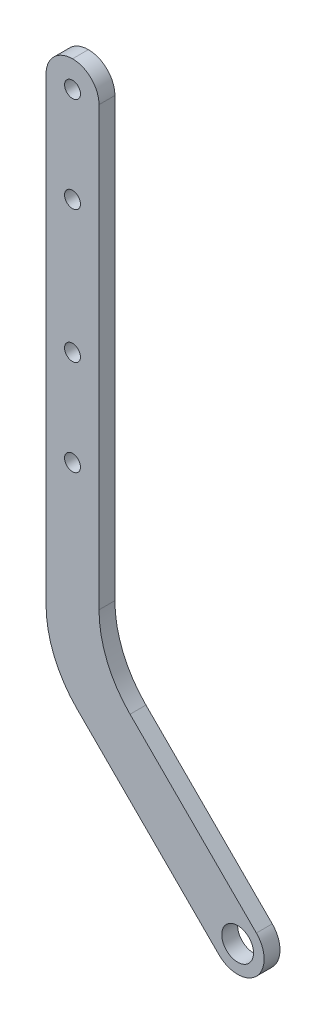
ISO-10303-21;
HEADER;
FILE_DESCRIPTION(('STEP AP214'),'2;1');
FILE_NAME('part.step','',(''),(''),'','','');
FILE_SCHEMA(('AUTOMOTIVE_DESIGN { 1 0 10303 214 1 1 1 1 }'));
ENDSEC;
DATA;
#1=APPLICATION_CONTEXT('core data for automotive mechanical design processes');
#2=APPLICATION_PROTOCOL_DEFINITION('international standard','automotive_design',2000,#1);
#3=PRODUCT_CONTEXT('',#1,'mechanical');
#4=PRODUCT('Part','Part','',(#3));
#5=PRODUCT_RELATED_PRODUCT_CATEGORY('part','',(#4));
#6=PRODUCT_DEFINITION_FORMATION('','',#4);
#7=PRODUCT_DEFINITION_CONTEXT('part definition',#1,'design');
#8=PRODUCT_DEFINITION('design','',#6,#7);
#9=PRODUCT_DEFINITION_SHAPE('','',#8);
#10=(LENGTH_UNIT() NAMED_UNIT(*) SI_UNIT(.MILLI.,.METRE.));
#11=(NAMED_UNIT(*) PLANE_ANGLE_UNIT() SI_UNIT($,.RADIAN.));
#12=(NAMED_UNIT(*) SI_UNIT($,.STERADIAN.) SOLID_ANGLE_UNIT());
#13=UNCERTAINTY_MEASURE_WITH_UNIT(LENGTH_MEASURE(1.E-05),#10,'distance_accuracy_value','');
#14=(GEOMETRIC_REPRESENTATION_CONTEXT(3) GLOBAL_UNCERTAINTY_ASSIGNED_CONTEXT((#13)) GLOBAL_UNIT_ASSIGNED_CONTEXT((#10,
#11,#12)) REPRESENTATION_CONTEXT('',''));
#15=CARTESIAN_POINT('',(0.,0.,0.));
#16=DIRECTION('',(0.,0.,1.));
#17=DIRECTION('',(1.,0.,0.));
#18=AXIS2_PLACEMENT_3D('',#15,#16,#17);
#19=CARTESIAN_POINT('',(0.,0.,3.));
#20=DIRECTION('',(0.,0.,-1.));
#21=DIRECTION('',(-1.,0.,0.));
#22=AXIS2_PLACEMENT_3D('',#19,#20,#21);
#23=PLANE('',#22);
#24=CARTESIAN_POINT('',(5.,95.,3.));
#25=DIRECTION('',(0.,0.,-1.));
#26=DIRECTION('',(-1.,0.,0.));
#27=AXIS2_PLACEMENT_3D('',#24,#25,#26);
#28=CIRCLE('',#27,5.);
#29=CARTESIAN_POINT('',(10.,95.,3.));
#30=VERTEX_POINT('',#29);
#31=CARTESIAN_POINT('',(5.,100.,3.));
#32=VERTEX_POINT('',#31);
#33=EDGE_CURVE('E56',#30,#32,#28,.F.);
#34=ORIENTED_EDGE('',*,*,#33,.T.);
#35=CARTESIAN_POINT('',(5.,95.,3.));
#36=DIRECTION('',(0.,0.,-1.));
#37=DIRECTION('',(-1.,0.,0.));
#38=AXIS2_PLACEMENT_3D('',#35,#36,#37);
#39=CIRCLE('',#38,5.);
#40=CARTESIAN_POINT('',(0.,95.,3.));
#41=VERTEX_POINT('',#40);
#42=EDGE_CURVE('E49',#32,#41,#39,.F.);
#43=ORIENTED_EDGE('',*,*,#42,.T.);
#44=DIRECTION('',(0.,-1.,0.));
#45=VECTOR('',#44,1.);
#46=CARTESIAN_POINT('',(0.,0.,3.));
#47=LINE('',#46,#45);
#48=CARTESIAN_POINT('',(0.,8.28427124746192,3.));
#49=VERTEX_POINT('',#48);
#50=EDGE_CURVE('E141',#41,#49,#47,.T.);
#51=ORIENTED_EDGE('',*,*,#50,.T.);
#52=CARTESIAN_POINT('',(20.,8.28427124746192,3.));
#53=DIRECTION('',(0.,0.,-1.));
#54=DIRECTION('',(-1.,0.,0.));
#55=AXIS2_PLACEMENT_3D('',#52,#53,#54);
#56=CIRCLE('',#55,20.);
#57=CARTESIAN_POINT('',(5.85786437626908,-5.85786437626906,3.));
#58=VERTEX_POINT('',#57);
#59=EDGE_CURVE('E168',#49,#58,#56,.F.);
#60=ORIENTED_EDGE('',*,*,#59,.T.);
#61=DIRECTION('',(0.707106781186549,-0.707106781186546,0.));
#62=VECTOR('',#61,1.);
#63=CARTESIAN_POINT('',(0.,0.,3.));
#64=LINE('',#63,#62);
#65=CARTESIAN_POINT('',(32.6287556748131,-32.628755674813,3.));
#66=VERTEX_POINT('',#65);
#67=EDGE_CURVE('E139',#58,#66,#64,.T.);
#68=ORIENTED_EDGE('',*,*,#67,.T.);
#69=CARTESIAN_POINT('',(36.1642895807458,-29.0932217688802,3.));
#70=DIRECTION('',(0.,0.,-1.));
#71=DIRECTION('',(-1.,0.,0.));
#72=AXIS2_PLACEMENT_3D('',#69,#70,#71);
#73=CIRCLE('',#72,5.);
#74=CARTESIAN_POINT('',(39.6998234866786,-32.628755674813,3.));
#75=VERTEX_POINT('',#74);
#76=EDGE_CURVE('E197',#66,#75,#73,.F.);
#77=ORIENTED_EDGE('',*,*,#76,.T.);
#78=CARTESIAN_POINT('',(36.1642895807458,-29.0932217688802,3.));
#79=DIRECTION('',(0.,0.,-1.));
#80=DIRECTION('',(-1.,0.,0.));
#81=AXIS2_PLACEMENT_3D('',#78,#79,#80);
#82=CIRCLE('',#81,5.);
#83=CARTESIAN_POINT('',(39.6998234866786,-25.5576878629475,3.));
#84=VERTEX_POINT('',#83);
#85=EDGE_CURVE('E194',#75,#84,#82,.F.);
#86=ORIENTED_EDGE('',*,*,#85,.T.);
#87=DIRECTION('',(-0.707106781186549,0.707106781186547,0.));
#88=VECTOR('',#87,1.);
#89=CARTESIAN_POINT('',(10.,4.142135623731,3.));
#90=LINE('',#89,#88);
#91=CARTESIAN_POINT('',(15.8578643762691,-1.71572875253805,3.));
#92=VERTEX_POINT('',#91);
#93=EDGE_CURVE('E274',#84,#92,#90,.T.);
#94=ORIENTED_EDGE('',*,*,#93,.T.);
#95=CARTESIAN_POINT('',(30.,12.4264068711929,3.));
#96=DIRECTION('',(0.,0.,-1.));
#97=DIRECTION('',(-1.,0.,0.));
#98=AXIS2_PLACEMENT_3D('',#95,#96,#97);
#99=CIRCLE('',#98,20.);
#100=CARTESIAN_POINT('',(10.,12.4264068711929,3.));
#101=VERTEX_POINT('',#100);
#102=EDGE_CURVE('E183',#92,#101,#99,.T.);
#103=ORIENTED_EDGE('',*,*,#102,.T.);
#104=DIRECTION('',(0.,1.,0.));
#105=VECTOR('',#104,1.);
#106=CARTESIAN_POINT('',(10.,100.,3.));
#107=LINE('',#106,#105);
#108=EDGE_CURVE('E230',#101,#30,#107,.T.);
#109=ORIENTED_EDGE('',*,*,#108,.T.);
#110=EDGE_LOOP('',(#34,#43,#51,#60,#68,#77,#86,#94,#103,#109));
#111=FACE_BOUND('',#110,.T.);
#112=CARTESIAN_POINT('',(5.,34.,3.));
#113=DIRECTION('',(0.,0.,1.));
#114=DIRECTION('',(1.,0.,0.));
#115=AXIS2_PLACEMENT_3D('',#112,#113,#114);
#116=CIRCLE('',#115,1.5);
#117=CARTESIAN_POINT('',(6.5,34.,3.));
#118=VERTEX_POINT('',#117);
#119=EDGE_CURVE('E149',#118,#118,#116,.T.);
#120=ORIENTED_EDGE('',*,*,#119,.F.);
#121=EDGE_LOOP('',(#120));
#122=FACE_BOUND('',#121,.T.);
#123=CARTESIAN_POINT('',(36.1642895807458,-29.0932217688802,3.));
#124=DIRECTION('',(0.,0.,1.));
#125=DIRECTION('',(1.,0.,0.));
#126=AXIS2_PLACEMENT_3D('',#123,#124,#125);
#127=CIRCLE('',#126,2.99999999999999);
#128=CARTESIAN_POINT('',(39.1642895807458,-29.0932217688802,3.));
#129=VERTEX_POINT('',#128);
#130=EDGE_CURVE('E263',#129,#129,#127,.T.);
#131=ORIENTED_EDGE('',*,*,#130,.F.);
#132=EDGE_LOOP('',(#131));
#133=FACE_BOUND('',#132,.T.);
#134=CARTESIAN_POINT('',(5.00000000000001,52.,3.));
#135=DIRECTION('',(0.,0.,1.));
#136=DIRECTION('',(1.,0.,0.));
#137=AXIS2_PLACEMENT_3D('',#134,#135,#136);
#138=CIRCLE('',#137,1.5);
#139=CARTESIAN_POINT('',(6.50000000000001,52.,3.));
#140=VERTEX_POINT('',#139);
#141=EDGE_CURVE('E255',#140,#140,#138,.T.);
#142=ORIENTED_EDGE('',*,*,#141,.F.);
#143=EDGE_LOOP('',(#142));
#144=FACE_BOUND('',#143,.T.);
#145=CARTESIAN_POINT('',(5.,77.,3.));
#146=DIRECTION('',(0.,0.,1.));
#147=DIRECTION('',(1.,0.,0.));
#148=AXIS2_PLACEMENT_3D('',#145,#146,#147);
#149=CIRCLE('',#148,1.5);
#150=CARTESIAN_POINT('',(6.5,77.,3.));
#151=VERTEX_POINT('',#150);
#152=EDGE_CURVE('E247',#151,#151,#149,.T.);
#153=ORIENTED_EDGE('',*,*,#152,.F.);
#154=EDGE_LOOP('',(#153));
#155=FACE_BOUND('',#154,.T.);
#156=CARTESIAN_POINT('',(5.,95.,3.));
#157=DIRECTION('',(0.,0.,1.));
#158=DIRECTION('',(1.,0.,0.));
#159=AXIS2_PLACEMENT_3D('',#156,#157,#158);
#160=CIRCLE('',#159,1.5);
#161=CARTESIAN_POINT('',(6.5,95.,3.));
#162=VERTEX_POINT('',#161);
#163=EDGE_CURVE('E239',#162,#162,#160,.T.);
#164=ORIENTED_EDGE('',*,*,#163,.F.);
#165=EDGE_LOOP('',(#164));
#166=FACE_BOUND('',#165,.T.);
#167=ADVANCED_FACE('F39',(#111,#122,#133,#144,#155,#166),#23,.F.);
#168=CARTESIAN_POINT('',(0.,0.,0.));
#169=DIRECTION('',(0.,0.,-1.));
#170=DIRECTION('',(-1.,0.,0.));
#171=AXIS2_PLACEMENT_3D('',#168,#169,#170);
#172=PLANE('',#171);
#173=CARTESIAN_POINT('',(5.,77.,0.));
#174=DIRECTION('',(0.,0.,1.));
#175=DIRECTION('',(1.,0.,0.));
#176=AXIS2_PLACEMENT_3D('',#173,#174,#175);
#177=CIRCLE('',#176,1.5);
#178=CARTESIAN_POINT('',(6.5,77.,0.));
#179=VERTEX_POINT('',#178);
#180=EDGE_CURVE('E243',#179,#179,#177,.T.);
#181=ORIENTED_EDGE('',*,*,#180,.T.);
#182=EDGE_LOOP('',(#181));
#183=FACE_BOUND('',#182,.T.);
#184=CARTESIAN_POINT('',(36.1642895807458,-29.0932217688802,0.));
#185=DIRECTION('',(0.,0.,1.));
#186=DIRECTION('',(1.,0.,0.));
#187=AXIS2_PLACEMENT_3D('',#184,#185,#186);
#188=CIRCLE('',#187,2.99999999999999);
#189=CARTESIAN_POINT('',(39.1642895807458,-29.0932217688802,0.));
#190=VERTEX_POINT('',#189);
#191=EDGE_CURVE('E259',#190,#190,#188,.T.);
#192=ORIENTED_EDGE('',*,*,#191,.T.);
#193=EDGE_LOOP('',(#192));
#194=FACE_BOUND('',#193,.T.);
#195=DIRECTION('',(0.,-1.,0.));
#196=VECTOR('',#195,1.);
#197=CARTESIAN_POINT('',(0.,0.,0.));
#198=LINE('',#197,#196);
#199=CARTESIAN_POINT('',(0.,95.,0.));
#200=VERTEX_POINT('',#199);
#201=CARTESIAN_POINT('',(0.,8.28427124746192,0.));
#202=VERTEX_POINT('',#201);
#203=EDGE_CURVE('E163',#200,#202,#198,.T.);
#204=ORIENTED_EDGE('',*,*,#203,.F.);
#205=CARTESIAN_POINT('',(5.,95.,0.));
#206=DIRECTION('',(0.,0.,-1.));
#207=DIRECTION('',(-1.,0.,0.));
#208=AXIS2_PLACEMENT_3D('',#205,#206,#207);
#209=CIRCLE('',#208,5.);
#210=CARTESIAN_POINT('',(5.,100.,0.));
#211=VERTEX_POINT('',#210);
#212=EDGE_CURVE('E215',#200,#211,#209,.T.);
#213=ORIENTED_EDGE('',*,*,#212,.T.);
#214=CARTESIAN_POINT('',(5.,95.,0.));
#215=DIRECTION('',(0.,0.,-1.));
#216=DIRECTION('',(-1.,0.,0.));
#217=AXIS2_PLACEMENT_3D('',#214,#215,#216);
#218=CIRCLE('',#217,5.);
#219=CARTESIAN_POINT('',(10.,95.,0.));
#220=VERTEX_POINT('',#219);
#221=EDGE_CURVE('E212',#211,#220,#218,.T.);
#222=ORIENTED_EDGE('',*,*,#221,.T.);
#223=DIRECTION('',(0.,1.,0.));
#224=VECTOR('',#223,1.);
#225=CARTESIAN_POINT('',(10.,100.,0.));
#226=LINE('',#225,#224);
#227=CARTESIAN_POINT('',(10.,12.4264068711929,0.));
#228=VERTEX_POINT('',#227);
#229=EDGE_CURVE('E153',#228,#220,#226,.T.);
#230=ORIENTED_EDGE('',*,*,#229,.F.);
#231=CARTESIAN_POINT('',(30.,12.4264068711929,0.));
#232=DIRECTION('',(0.,0.,-1.));
#233=DIRECTION('',(-1.,0.,0.));
#234=AXIS2_PLACEMENT_3D('',#231,#232,#233);
#235=CIRCLE('',#234,20.);
#236=CARTESIAN_POINT('',(15.8578643762691,-1.71572875253805,0.));
#237=VERTEX_POINT('',#236);
#238=EDGE_CURVE('E179',#228,#237,#235,.F.);
#239=ORIENTED_EDGE('',*,*,#238,.T.);
#240=DIRECTION('',(-0.707106781186549,0.707106781186547,0.));
#241=VECTOR('',#240,1.);
#242=CARTESIAN_POINT('',(10.,4.142135623731,0.));
#243=LINE('',#242,#241);
#244=CARTESIAN_POINT('',(39.6998234866786,-25.5576878629475,0.));
#245=VERTEX_POINT('',#244);
#246=EDGE_CURVE('E148',#245,#237,#243,.T.);
#247=ORIENTED_EDGE('',*,*,#246,.F.);
#248=CARTESIAN_POINT('',(36.1642895807458,-29.0932217688802,0.));
#249=DIRECTION('',(0.,0.,-1.));
#250=DIRECTION('',(-1.,0.,0.));
#251=AXIS2_PLACEMENT_3D('',#248,#249,#250);
#252=CIRCLE('',#251,5.);
#253=CARTESIAN_POINT('',(39.6998234866786,-32.628755674813,0.));
#254=VERTEX_POINT('',#253);
#255=EDGE_CURVE('E186',#245,#254,#252,.T.);
#256=ORIENTED_EDGE('',*,*,#255,.T.);
#257=CARTESIAN_POINT('',(36.1642895807458,-29.0932217688802,0.));
#258=DIRECTION('',(0.,0.,-1.));
#259=DIRECTION('',(-1.,0.,0.));
#260=AXIS2_PLACEMENT_3D('',#257,#258,#259);
#261=CIRCLE('',#260,5.);
#262=CARTESIAN_POINT('',(32.6287556748131,-32.628755674813,0.));
#263=VERTEX_POINT('',#262);
#264=EDGE_CURVE('E146',#254,#263,#261,.T.);
#265=ORIENTED_EDGE('',*,*,#264,.T.);
#266=DIRECTION('',(0.707106781186549,-0.707106781186546,0.));
#267=VECTOR('',#266,1.);
#268=CARTESIAN_POINT('',(0.,0.,0.));
#269=LINE('',#268,#267);
#270=CARTESIAN_POINT('',(5.85786437626908,-5.85786437626906,0.));
#271=VERTEX_POINT('',#270);
#272=EDGE_CURVE('E136',#271,#263,#269,.T.);
#273=ORIENTED_EDGE('',*,*,#272,.F.);
#274=CARTESIAN_POINT('',(20.,8.28427124746192,0.));
#275=DIRECTION('',(0.,0.,-1.));
#276=DIRECTION('',(-1.,0.,0.));
#277=AXIS2_PLACEMENT_3D('',#274,#275,#276);
#278=CIRCLE('',#277,20.);
#279=EDGE_CURVE('E119',#271,#202,#278,.T.);
#280=ORIENTED_EDGE('',*,*,#279,.T.);
#281=EDGE_LOOP('',(#204,#213,#222,#230,#239,#247,#256,#265,#273,#280));
#282=FACE_BOUND('',#281,.T.);
#283=CARTESIAN_POINT('',(5.,34.,0.));
#284=DIRECTION('',(0.,0.,1.));
#285=DIRECTION('',(1.,0.,0.));
#286=AXIS2_PLACEMENT_3D('',#283,#284,#285);
#287=CIRCLE('',#286,1.5);
#288=CARTESIAN_POINT('',(6.5,34.,0.));
#289=VERTEX_POINT('',#288);
#290=EDGE_CURVE('E156',#289,#289,#287,.T.);
#291=ORIENTED_EDGE('',*,*,#290,.T.);
#292=EDGE_LOOP('',(#291));
#293=FACE_BOUND('',#292,.T.);
#294=CARTESIAN_POINT('',(5.00000000000001,52.,0.));
#295=DIRECTION('',(0.,0.,1.));
#296=DIRECTION('',(1.,0.,0.));
#297=AXIS2_PLACEMENT_3D('',#294,#295,#296);
#298=CIRCLE('',#297,1.5);
#299=CARTESIAN_POINT('',(6.50000000000001,52.,0.));
#300=VERTEX_POINT('',#299);
#301=EDGE_CURVE('E251',#300,#300,#298,.T.);
#302=ORIENTED_EDGE('',*,*,#301,.T.);
#303=EDGE_LOOP('',(#302));
#304=FACE_BOUND('',#303,.T.);
#305=CARTESIAN_POINT('',(5.,95.,0.));
#306=DIRECTION('',(0.,0.,1.));
#307=DIRECTION('',(1.,0.,0.));
#308=AXIS2_PLACEMENT_3D('',#305,#306,#307);
#309=CIRCLE('',#308,1.5);
#310=CARTESIAN_POINT('',(6.5,95.,0.));
#311=VERTEX_POINT('',#310);
#312=EDGE_CURVE('E208',#311,#311,#309,.T.);
#313=ORIENTED_EDGE('',*,*,#312,.T.);
#314=EDGE_LOOP('',(#313));
#315=FACE_BOUND('',#314,.T.);
#316=ADVANCED_FACE('F143',(#183,#194,#282,#293,#304,#315),#172,.T.);
#317=CARTESIAN_POINT('',(0.,0.,3.));
#318=DIRECTION('',(0.707106781186546,0.707106781186549,0.));
#319=DIRECTION('',(-0.707106781186549,0.707106781186546,0.));
#320=AXIS2_PLACEMENT_3D('',#317,#318,#319);
#321=PLANE('',#320);
#322=ORIENTED_EDGE('',*,*,#272,.T.);
#323=DIRECTION('',(0.,0.,-1.));
#324=VECTOR('',#323,1.);
#325=CARTESIAN_POINT('',(32.6287556748131,-32.628755674813,3.));
#326=LINE('',#325,#324);
#327=EDGE_CURVE('E191',#263,#66,#326,.F.);
#328=ORIENTED_EDGE('',*,*,#327,.T.);
#329=ORIENTED_EDGE('',*,*,#67,.F.);
#330=DIRECTION('',(0.,0.,-1.));
#331=VECTOR('',#330,1.);
#332=CARTESIAN_POINT('',(5.85786437626908,-5.85786437626906,3.));
#333=LINE('',#332,#331);
#334=EDGE_CURVE('E123',#58,#271,#333,.T.);
#335=ORIENTED_EDGE('',*,*,#334,.T.);
#336=EDGE_LOOP('',(#322,#328,#329,#335));
#337=FACE_BOUND('',#336,.T.);
#338=ADVANCED_FACE('F134',(#337),#321,.F.);
#339=CARTESIAN_POINT('',(10.,4.142135623731,3.));
#340=DIRECTION('',(-0.707106781186547,-0.707106781186548,0.));
#341=DIRECTION('',(0.707106781186548,-0.707106781186547,0.));
#342=AXIS2_PLACEMENT_3D('',#339,#340,#341);
#343=PLANE('',#342);
#344=ORIENTED_EDGE('',*,*,#93,.F.);
#345=DIRECTION('',(0.,0.,-1.));
#346=VECTOR('',#345,1.);
#347=CARTESIAN_POINT('',(39.6998234866786,-25.5576878629475,3.));
#348=LINE('',#347,#346);
#349=EDGE_CURVE('E200',#84,#245,#348,.T.);
#350=ORIENTED_EDGE('',*,*,#349,.T.);
#351=ORIENTED_EDGE('',*,*,#246,.T.);
#352=DIRECTION('',(0.,0.,-1.));
#353=VECTOR('',#352,1.);
#354=CARTESIAN_POINT('',(15.8578643762691,-1.71572875253805,3.));
#355=LINE('',#354,#353);
#356=EDGE_CURVE('E175',#237,#92,#355,.F.);
#357=ORIENTED_EDGE('',*,*,#356,.T.);
#358=EDGE_LOOP('',(#344,#350,#351,#357));
#359=FACE_BOUND('',#358,.T.);
#360=ADVANCED_FACE('F294',(#359),#343,.F.);
#361=CARTESIAN_POINT('',(10.,100.,3.));
#362=DIRECTION('',(-1.,0.,0.));
#363=DIRECTION('',(0.,-1.,0.));
#364=AXIS2_PLACEMENT_3D('',#361,#362,#363);
#365=PLANE('',#364);
#366=ORIENTED_EDGE('',*,*,#229,.T.);
#367=DIRECTION('',(0.,0.,-1.));
#368=VECTOR('',#367,1.);
#369=CARTESIAN_POINT('',(10.,95.,3.));
#370=LINE('',#369,#368);
#371=EDGE_CURVE('E11',#220,#30,#370,.F.);
#372=ORIENTED_EDGE('',*,*,#371,.T.);
#373=ORIENTED_EDGE('',*,*,#108,.F.);
#374=DIRECTION('',(0.,0.,-1.));
#375=VECTOR('',#374,1.);
#376=CARTESIAN_POINT('',(10.,12.4264068711929,0.));
#377=LINE('',#376,#375);
#378=EDGE_CURVE('E171',#101,#228,#377,.T.);
#379=ORIENTED_EDGE('',*,*,#378,.T.);
#380=EDGE_LOOP('',(#366,#372,#373,#379));
#381=FACE_BOUND('',#380,.T.);
#382=ADVANCED_FACE('F279',(#381),#365,.F.);
#383=CARTESIAN_POINT('',(0.,0.,3.));
#384=DIRECTION('',(1.,0.,0.));
#385=DIRECTION('',(0.,0.,-1.));
#386=AXIS2_PLACEMENT_3D('',#383,#384,#385);
#387=PLANE('',#386);
#388=ORIENTED_EDGE('',*,*,#50,.F.);
#389=DIRECTION('',(0.,0.,-1.));
#390=VECTOR('',#389,1.);
#391=CARTESIAN_POINT('',(0.,95.,3.));
#392=LINE('',#391,#390);
#393=EDGE_CURVE('E203',#41,#200,#392,.T.);
#394=ORIENTED_EDGE('',*,*,#393,.T.);
#395=ORIENTED_EDGE('',*,*,#203,.T.);
#396=DIRECTION('',(0.,0.,-1.));
#397=VECTOR('',#396,1.);
#398=CARTESIAN_POINT('',(0.,8.28427124746192,3.));
#399=LINE('',#398,#397);
#400=EDGE_CURVE('E125',#202,#49,#399,.F.);
#401=ORIENTED_EDGE('',*,*,#400,.T.);
#402=EDGE_LOOP('',(#388,#394,#395,#401));
#403=FACE_BOUND('',#402,.T.);
#404=ADVANCED_FACE('F228',(#403),#387,.F.);
#405=CARTESIAN_POINT('',(5.,34.,3.));
#406=DIRECTION('',(0.,0.,-1.));
#407=DIRECTION('',(-1.,0.,0.));
#408=AXIS2_PLACEMENT_3D('',#405,#406,#407);
#409=CYLINDRICAL_SURFACE('',#408,1.5);
#410=ORIENTED_EDGE('',*,*,#119,.T.);
#411=EDGE_LOOP('',(#410));
#412=FACE_BOUND('',#411,.T.);
#413=ORIENTED_EDGE('',*,*,#290,.F.);
#414=EDGE_LOOP('',(#413));
#415=FACE_BOUND('',#414,.T.);
#416=ADVANCED_FACE('F311',(#412,#415),#409,.F.);
#417=CARTESIAN_POINT('',(36.1642895807458,-29.0932217688802,3.));
#418=DIRECTION('',(0.,0.,-1.));
#419=DIRECTION('',(-1.,0.,0.));
#420=AXIS2_PLACEMENT_3D('',#417,#418,#419);
#421=CYLINDRICAL_SURFACE('',#420,2.99999999999999);
#422=ORIENTED_EDGE('',*,*,#130,.T.);
#423=EDGE_LOOP('',(#422));
#424=FACE_BOUND('',#423,.T.);
#425=ORIENTED_EDGE('',*,*,#191,.F.);
#426=EDGE_LOOP('',(#425));
#427=FACE_BOUND('',#426,.T.);
#428=ADVANCED_FACE('F318',(#424,#427),#421,.F.);
#429=CARTESIAN_POINT('',(5.00000000000001,52.,3.));
#430=DIRECTION('',(0.,0.,-1.));
#431=DIRECTION('',(-1.,0.,0.));
#432=AXIS2_PLACEMENT_3D('',#429,#430,#431);
#433=CYLINDRICAL_SURFACE('',#432,1.5);
#434=ORIENTED_EDGE('',*,*,#141,.T.);
#435=EDGE_LOOP('',(#434));
#436=FACE_BOUND('',#435,.T.);
#437=ORIENTED_EDGE('',*,*,#301,.F.);
#438=EDGE_LOOP('',(#437));
#439=FACE_BOUND('',#438,.T.);
#440=ADVANCED_FACE('F323',(#436,#439),#433,.F.);
#441=CARTESIAN_POINT('',(5.,77.,3.));
#442=DIRECTION('',(0.,0.,-1.));
#443=DIRECTION('',(-1.,0.,0.));
#444=AXIS2_PLACEMENT_3D('',#441,#442,#443);
#445=CYLINDRICAL_SURFACE('',#444,1.5);
#446=ORIENTED_EDGE('',*,*,#152,.T.);
#447=EDGE_LOOP('',(#446));
#448=FACE_BOUND('',#447,.T.);
#449=ORIENTED_EDGE('',*,*,#180,.F.);
#450=EDGE_LOOP('',(#449));
#451=FACE_BOUND('',#450,.T.);
#452=ADVANCED_FACE('F339',(#448,#451),#445,.F.);
#453=CARTESIAN_POINT('',(5.,95.,3.));
#454=DIRECTION('',(0.,0.,-1.));
#455=DIRECTION('',(-1.,0.,0.));
#456=AXIS2_PLACEMENT_3D('',#453,#454,#455);
#457=CYLINDRICAL_SURFACE('',#456,1.5);
#458=ORIENTED_EDGE('',*,*,#163,.T.);
#459=EDGE_LOOP('',(#458));
#460=FACE_BOUND('',#459,.T.);
#461=ORIENTED_EDGE('',*,*,#312,.F.);
#462=EDGE_LOOP('',(#461));
#463=FACE_BOUND('',#462,.T.);
#464=ADVANCED_FACE('F336',(#460,#463),#457,.F.);
#465=CARTESIAN_POINT('',(20.,8.28427124746192,3.));
#466=DIRECTION('',(0.,0.,-1.));
#467=DIRECTION('',(-1.,0.,0.));
#468=AXIS2_PLACEMENT_3D('',#465,#466,#467);
#469=CYLINDRICAL_SURFACE('',#468,20.);
#470=ORIENTED_EDGE('',*,*,#59,.F.);
#471=ORIENTED_EDGE('',*,*,#400,.F.);
#472=ORIENTED_EDGE('',*,*,#279,.F.);
#473=ORIENTED_EDGE('',*,*,#334,.F.);
#474=EDGE_LOOP('',(#470,#471,#472,#473));
#475=FACE_BOUND('',#474,.T.);
#476=ADVANCED_FACE('F122',(#475),#469,.T.);
#477=CARTESIAN_POINT('',(30.,12.4264068711929,3.));
#478=DIRECTION('',(0.,0.,1.));
#479=DIRECTION('',(1.,0.,0.));
#480=AXIS2_PLACEMENT_3D('',#477,#478,#479);
#481=CYLINDRICAL_SURFACE('',#480,20.);
#482=ORIENTED_EDGE('',*,*,#102,.F.);
#483=ORIENTED_EDGE('',*,*,#356,.F.);
#484=ORIENTED_EDGE('',*,*,#238,.F.);
#485=ORIENTED_EDGE('',*,*,#378,.F.);
#486=EDGE_LOOP('',(#482,#483,#484,#485));
#487=FACE_BOUND('',#486,.T.);
#488=ADVANCED_FACE('F281',(#487),#481,.F.);
#489=CARTESIAN_POINT('',(36.1642895807458,-29.0932217688802,3.));
#490=DIRECTION('',(0.,0.,-1.));
#491=DIRECTION('',(-1.,0.,0.));
#492=AXIS2_PLACEMENT_3D('',#489,#490,#491);
#493=CYLINDRICAL_SURFACE('',#492,5.);
#494=ORIENTED_EDGE('',*,*,#349,.F.);
#495=ORIENTED_EDGE('',*,*,#85,.F.);
#496=DIRECTION('',(0.,0.,-1.));
#497=VECTOR('',#496,1.);
#498=CARTESIAN_POINT('',(39.6998234866786,-32.628755674813,3.));
#499=LINE('',#498,#497);
#500=EDGE_CURVE('E204',#254,#75,#499,.F.);
#501=ORIENTED_EDGE('',*,*,#500,.F.);
#502=ORIENTED_EDGE('',*,*,#255,.F.);
#503=EDGE_LOOP('',(#494,#495,#501,#502));
#504=FACE_BOUND('',#503,.T.);
#505=ADVANCED_FACE('F289',(#504),#493,.T.);
#506=CARTESIAN_POINT('',(36.1642895807458,-29.0932217688802,3.));
#507=DIRECTION('',(0.,0.,-1.));
#508=DIRECTION('',(-1.,0.,0.));
#509=AXIS2_PLACEMENT_3D('',#506,#507,#508);
#510=CYLINDRICAL_SURFACE('',#509,5.);
#511=ORIENTED_EDGE('',*,*,#76,.F.);
#512=ORIENTED_EDGE('',*,*,#327,.F.);
#513=ORIENTED_EDGE('',*,*,#264,.F.);
#514=ORIENTED_EDGE('',*,*,#500,.T.);
#515=EDGE_LOOP('',(#511,#512,#513,#514));
#516=FACE_BOUND('',#515,.T.);
#517=ADVANCED_FACE('F292',(#516),#510,.T.);
#518=CARTESIAN_POINT('',(5.,95.,3.));
#519=DIRECTION('',(0.,0.,-1.));
#520=DIRECTION('',(-1.,0.,0.));
#521=AXIS2_PLACEMENT_3D('',#518,#519,#520);
#522=CYLINDRICAL_SURFACE('',#521,5.);
#523=DIRECTION('',(0.,0.,-1.));
#524=VECTOR('',#523,1.);
#525=CARTESIAN_POINT('',(5.,100.,3.));
#526=LINE('',#525,#524);
#527=EDGE_CURVE('E43',#32,#211,#526,.T.);
#528=ORIENTED_EDGE('',*,*,#527,.F.);
#529=ORIENTED_EDGE('',*,*,#33,.F.);
#530=ORIENTED_EDGE('',*,*,#371,.F.);
#531=ORIENTED_EDGE('',*,*,#221,.F.);
#532=EDGE_LOOP('',(#528,#529,#530,#531));
#533=FACE_BOUND('',#532,.T.);
#534=ADVANCED_FACE('F41',(#533),#522,.T.);
#535=CARTESIAN_POINT('',(5.,95.,3.));
#536=DIRECTION('',(0.,0.,-1.));
#537=DIRECTION('',(-1.,0.,0.));
#538=AXIS2_PLACEMENT_3D('',#535,#536,#537);
#539=CYLINDRICAL_SURFACE('',#538,5.);
#540=ORIENTED_EDGE('',*,*,#42,.F.);
#541=ORIENTED_EDGE('',*,*,#527,.T.);
#542=ORIENTED_EDGE('',*,*,#212,.F.);
#543=ORIENTED_EDGE('',*,*,#393,.F.);
#544=EDGE_LOOP('',(#540,#541,#542,#543));
#545=FACE_BOUND('',#544,.T.);
#546=ADVANCED_FACE('F231',(#545),#539,.T.);
#547=CLOSED_SHELL('',(#167,#316,#338,#360,#382,#404,#416,#428,#440,#452,#464,#476,#488,#505,
#517,#534,#546));
#548=MANIFOLD_SOLID_BREP('B2',#547);
#549=ADVANCED_BREP_SHAPE_REPRESENTATION('',(#18,#548),#14);
#550=SHAPE_DEFINITION_REPRESENTATION(#9,#549);
ENDSEC;
END-ISO-10303-21;
